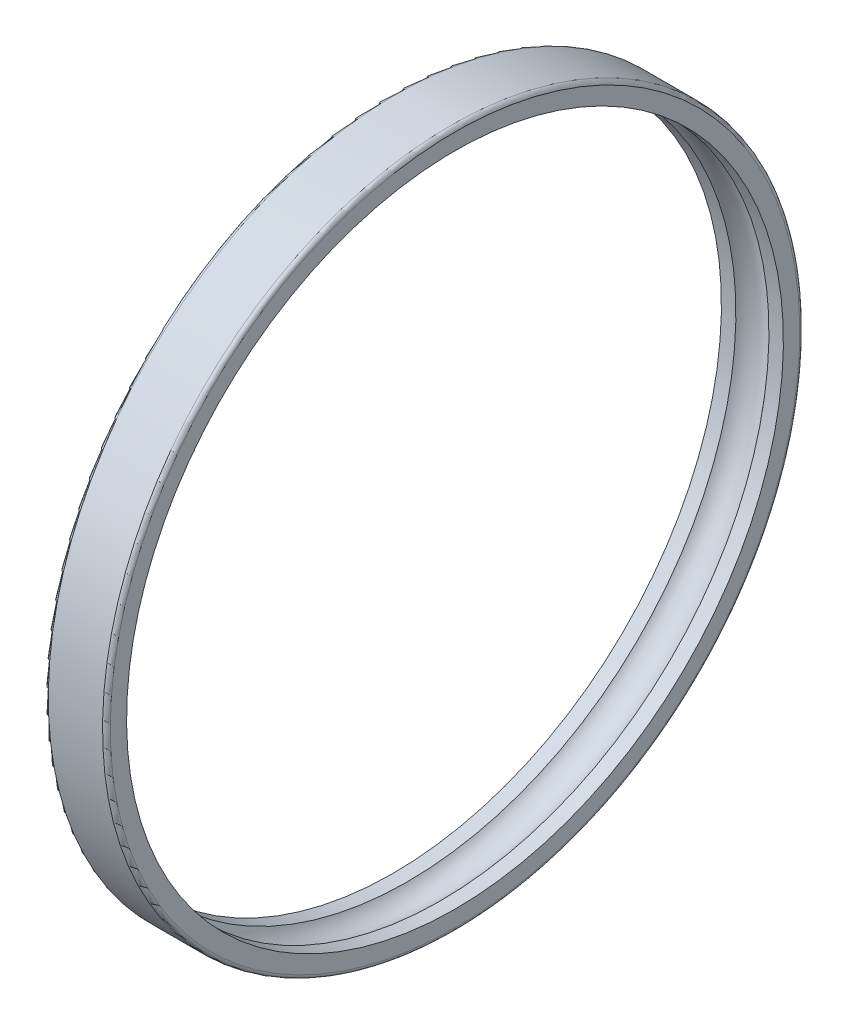
ISO-10303-21;
HEADER;
FILE_DESCRIPTION(('STEP AP214'),'2;1');
FILE_NAME('part.step','',(''),(''),'','','');
FILE_SCHEMA(('AUTOMOTIVE_DESIGN { 1 0 10303 214 1 1 1 1 }'));
ENDSEC;
DATA;
#1=APPLICATION_CONTEXT('core data for automotive mechanical design processes');
#2=APPLICATION_PROTOCOL_DEFINITION('international standard','automotive_design',2000,#1);
#3=PRODUCT_CONTEXT('',#1,'mechanical');
#4=PRODUCT('Part','Part','',(#3));
#5=PRODUCT_RELATED_PRODUCT_CATEGORY('part','',(#4));
#6=PRODUCT_DEFINITION_FORMATION('','',#4);
#7=PRODUCT_DEFINITION_CONTEXT('part definition',#1,'design');
#8=PRODUCT_DEFINITION('design','',#6,#7);
#9=PRODUCT_DEFINITION_SHAPE('','',#8);
#10=(LENGTH_UNIT() NAMED_UNIT(*) SI_UNIT(.MILLI.,.METRE.));
#11=(NAMED_UNIT(*) PLANE_ANGLE_UNIT() SI_UNIT($,.RADIAN.));
#12=(NAMED_UNIT(*) SI_UNIT($,.STERADIAN.) SOLID_ANGLE_UNIT());
#13=UNCERTAINTY_MEASURE_WITH_UNIT(LENGTH_MEASURE(1.E-05),#10,'distance_accuracy_value','');
#14=(GEOMETRIC_REPRESENTATION_CONTEXT(3) GLOBAL_UNCERTAINTY_ASSIGNED_CONTEXT((#13)) GLOBAL_UNIT_ASSIGNED_CONTEXT((#10,
#11,#12)) REPRESENTATION_CONTEXT('',''));
#15=CARTESIAN_POINT('',(0.,0.,0.));
#16=DIRECTION('',(0.,0.,1.));
#17=DIRECTION('',(1.,0.,0.));
#18=AXIS2_PLACEMENT_3D('',#15,#16,#17);
#19=CARTESIAN_POINT('',(-9.00099999999988,0.,0.));
#20=DIRECTION('',(1.,0.,0.));
#21=DIRECTION('',(0.,-0.866025403784439,-0.5));
#22=AXIS2_PLACEMENT_3D('',#19,#20,#21);
#23=TOROIDAL_SURFACE('',#22,133.5,1.49999999999995);
#24=CARTESIAN_POINT('',(-9.00099999999988,0.,0.));
#25=DIRECTION('',(1.,0.,0.));
#26=DIRECTION('',(0.,-0.866025403784439,-0.5));
#27=AXIS2_PLACEMENT_3D('',#24,#25,#26);
#28=CIRCLE('',#27,135.);
#29=CARTESIAN_POINT('',(-9.00099999999989,116.913429510899,67.5));
#30=VERTEX_POINT('',#29);
#31=EDGE_CURVE('E25',#30,#30,#28,.T.);
#32=ORIENTED_EDGE('',*,*,#31,.F.);
#33=CARTESIAN_POINT('',(-9.00099999999989,115.614391405223,66.75));
#34=DIRECTION('',(0.,-0.5,0.866025403784439));
#35=DIRECTION('',(0.,0.866025403784439,0.5));
#36=AXIS2_PLACEMENT_3D('',#33,#34,#35);
#37=CIRCLE('',#36,1.49999999999995);
#38=CARTESIAN_POINT('',(-10.501,115.614391405223,66.75));
#39=VERTEX_POINT('',#38);
#40=EDGE_CURVE('E11',#30,#39,#37,.T.);
#41=ORIENTED_EDGE('',*,*,#40,.T.);
#42=CARTESIAN_POINT('',(-10.501,0.,0.));
#43=DIRECTION('',(1.,0.,0.));
#44=DIRECTION('',(0.,-0.866025403784439,-0.5));
#45=AXIS2_PLACEMENT_3D('',#42,#43,#44);
#46=CIRCLE('',#45,133.5);
#47=EDGE_CURVE('E70',#39,#39,#46,.T.);
#48=ORIENTED_EDGE('',*,*,#47,.T.);
#49=ORIENTED_EDGE('',*,*,#40,.F.);
#50=EDGE_LOOP('',(#32,#41,#48,#49));
#51=FACE_BOUND('',#50,.T.);
#52=ADVANCED_FACE('F17',(#51),#23,.T.);
#53=CARTESIAN_POINT('',(13.499,0.,0.));
#54=DIRECTION('',(1.,0.,0.));
#55=DIRECTION('',(0.,-0.866025403784439,-0.5));
#56=AXIS2_PLACEMENT_3D('',#53,#54,#55);
#57=CYLINDRICAL_SURFACE('',#56,135.);
#58=CARTESIAN_POINT('',(11.999,0.,0.));
#59=DIRECTION('',(1.,0.,0.));
#60=DIRECTION('',(0.,-0.866025403784439,-0.5));
#61=AXIS2_PLACEMENT_3D('',#58,#59,#60);
#62=CIRCLE('',#61,135.);
#63=CARTESIAN_POINT('',(11.999,116.913429510899,67.5));
#64=VERTEX_POINT('',#63);
#65=EDGE_CURVE('E74',#64,#64,#62,.T.);
#66=ORIENTED_EDGE('',*,*,#65,.F.);
#67=DIRECTION('',(-1.,0.,0.));
#68=VECTOR('',#67,1.);
#69=CARTESIAN_POINT('',(13.499,116.913429510899,67.5));
#70=LINE('',#69,#68);
#71=EDGE_CURVE('E44',#64,#30,#70,.T.);
#72=ORIENTED_EDGE('',*,*,#71,.T.);
#73=ORIENTED_EDGE('',*,*,#31,.T.);
#74=ORIENTED_EDGE('',*,*,#71,.F.);
#75=EDGE_LOOP('',(#66,#72,#73,#74));
#76=FACE_BOUND('',#75,.T.);
#77=ADVANCED_FACE('F73',(#76),#57,.T.);
#78=CARTESIAN_POINT('',(11.999,0.,0.));
#79=DIRECTION('',(1.,0.,0.));
#80=DIRECTION('',(0.,-0.866025403784439,-0.5));
#81=AXIS2_PLACEMENT_3D('',#78,#79,#80);
#82=TOROIDAL_SURFACE('',#81,133.5,1.49999999999996);
#83=CARTESIAN_POINT('',(13.499,0.,0.));
#84=DIRECTION('',(1.,0.,0.));
#85=DIRECTION('',(0.,-0.866025403784439,-0.5));
#86=AXIS2_PLACEMENT_3D('',#83,#84,#85);
#87=CIRCLE('',#86,133.5);
#88=CARTESIAN_POINT('',(13.499,115.614391405223,66.75));
#89=VERTEX_POINT('',#88);
#90=EDGE_CURVE('E85',#89,#89,#87,.T.);
#91=ORIENTED_EDGE('',*,*,#90,.F.);
#92=CARTESIAN_POINT('',(11.999,115.614391405223,66.75));
#93=DIRECTION('',(0.,-0.5,0.866025403784439));
#94=DIRECTION('',(0.,0.866025403784439,0.5));
#95=AXIS2_PLACEMENT_3D('',#92,#93,#94);
#96=CIRCLE('',#95,1.49999999999996);
#97=EDGE_CURVE('E79',#89,#64,#96,.T.);
#98=ORIENTED_EDGE('',*,*,#97,.T.);
#99=ORIENTED_EDGE('',*,*,#65,.T.);
#100=ORIENTED_EDGE('',*,*,#97,.F.);
#101=EDGE_LOOP('',(#91,#98,#99,#100));
#102=FACE_BOUND('',#101,.T.);
#103=ADVANCED_FACE('F132',(#102),#82,.T.);
#104=CARTESIAN_POINT('',(13.499,63.59375,-110.147606043833));
#105=DIRECTION('',(1.,0.,0.));
#106=DIRECTION('',(0.,1.,0.));
#107=AXIS2_PLACEMENT_3D('',#104,#105,#106);
#108=PLANE('',#107);
#109=CARTESIAN_POINT('',(13.499,0.,0.));
#110=DIRECTION('',(1.,0.,0.));
#111=DIRECTION('',(0.,-0.866025403784439,-0.5));
#112=AXIS2_PLACEMENT_3D('',#109,#110,#111);
#113=CIRCLE('',#112,127.1875);
#114=CARTESIAN_POINT('',(13.499,110.147606043833,63.59375));
#115=VERTEX_POINT('',#114);
#116=EDGE_CURVE('E82',#115,#115,#113,.T.);
#117=ORIENTED_EDGE('',*,*,#116,.F.);
#118=EDGE_LOOP('',(#117));
#119=FACE_BOUND('',#118,.T.);
#120=ORIENTED_EDGE('',*,*,#90,.T.);
#121=EDGE_LOOP('',(#120));
#122=FACE_BOUND('',#121,.T.);
#123=ADVANCED_FACE('F134',(#119,#122),#108,.T.);
#124=CARTESIAN_POINT('',(13.499,0.,0.));
#125=DIRECTION('',(1.,0.,0.));
#126=DIRECTION('',(0.,-0.866025403784439,-0.5));
#127=AXIS2_PLACEMENT_3D('',#124,#125,#126);
#128=CYLINDRICAL_SURFACE('',#127,127.1875);
#129=CARTESIAN_POINT('',(7.9033442287249,0.,0.));
#130=DIRECTION('',(1.,0.,0.));
#131=DIRECTION('',(0.,-0.866025403784439,-0.5));
#132=AXIS2_PLACEMENT_3D('',#129,#130,#131);
#133=CIRCLE('',#132,127.1875);
#134=CARTESIAN_POINT('',(7.9033442287249,110.147606043833,63.59375));
#135=VERTEX_POINT('',#134);
#136=EDGE_CURVE('E90',#135,#135,#133,.T.);
#137=ORIENTED_EDGE('',*,*,#136,.F.);
#138=DIRECTION('',(1.,0.,0.));
#139=VECTOR('',#138,1.);
#140=CARTESIAN_POINT('',(13.499,110.147606043833,63.59375));
#141=LINE('',#140,#139);
#142=EDGE_CURVE('E86',#135,#115,#141,.T.);
#143=ORIENTED_EDGE('',*,*,#142,.T.);
#144=ORIENTED_EDGE('',*,*,#116,.T.);
#145=ORIENTED_EDGE('',*,*,#142,.F.);
#146=EDGE_LOOP('',(#137,#143,#144,#145));
#147=FACE_BOUND('',#146,.T.);
#148=ADVANCED_FACE('F136',(#147),#128,.F.);
#149=CARTESIAN_POINT('',(1.49900000000017,0.,0.));
#150=DIRECTION('',(1.,0.,0.));
#151=DIRECTION('',(0.,-0.866025403784439,-0.5));
#152=AXIS2_PLACEMENT_3D('',#149,#150,#151);
#153=TOROIDAL_SURFACE('',#152,122.1875,8.125);
#154=CARTESIAN_POINT('',(-4.90534422872464,0.,0.));
#155=DIRECTION('',(1.,0.,0.));
#156=DIRECTION('',(0.,-0.866025403784439,-0.5));
#157=AXIS2_PLACEMENT_3D('',#154,#155,#156);
#158=CIRCLE('',#157,127.1875);
#159=CARTESIAN_POINT('',(-4.90534422872465,110.147606043833,63.59375));
#160=VERTEX_POINT('',#159);
#161=EDGE_CURVE('E101',#160,#160,#158,.T.);
#162=ORIENTED_EDGE('',*,*,#161,.F.);
#163=CARTESIAN_POINT('',(1.49900000000016,105.817479024911,61.09375));
#164=DIRECTION('',(0.,0.5,-0.866025403784439));
#165=DIRECTION('',(0.,0.866025403784439,0.5));
#166=AXIS2_PLACEMENT_3D('',#163,#164,#165);
#167=CIRCLE('',#166,8.125);
#168=EDGE_CURVE('E96',#160,#135,#167,.T.);
#169=ORIENTED_EDGE('',*,*,#168,.T.);
#170=ORIENTED_EDGE('',*,*,#136,.T.);
#171=ORIENTED_EDGE('',*,*,#168,.F.);
#172=EDGE_LOOP('',(#162,#169,#170,#171));
#173=FACE_BOUND('',#172,.T.);
#174=ADVANCED_FACE('F144',(#173),#153,.F.);
#175=CARTESIAN_POINT('',(13.499,0.,0.));
#176=DIRECTION('',(1.,0.,0.));
#177=DIRECTION('',(0.,-0.866025403784439,-0.5));
#178=AXIS2_PLACEMENT_3D('',#175,#176,#177);
#179=CYLINDRICAL_SURFACE('',#178,127.1875);
#180=CARTESIAN_POINT('',(-10.501,0.,0.));
#181=DIRECTION('',(1.,0.,0.));
#182=DIRECTION('',(0.,-0.866025403784439,-0.5));
#183=AXIS2_PLACEMENT_3D('',#180,#181,#182);
#184=CIRCLE('',#183,127.1875);
#185=CARTESIAN_POINT('',(-10.501,110.147606043833,63.59375));
#186=VERTEX_POINT('',#185);
#187=EDGE_CURVE('E106',#186,#186,#184,.T.);
#188=ORIENTED_EDGE('',*,*,#187,.F.);
#189=DIRECTION('',(1.,0.,0.));
#190=VECTOR('',#189,1.);
#191=CARTESIAN_POINT('',(13.499,110.147606043833,63.59375));
#192=LINE('',#191,#190);
#193=EDGE_CURVE('E102',#186,#160,#192,.T.);
#194=ORIENTED_EDGE('',*,*,#193,.T.);
#195=ORIENTED_EDGE('',*,*,#161,.T.);
#196=ORIENTED_EDGE('',*,*,#193,.F.);
#197=EDGE_LOOP('',(#188,#194,#195,#196));
#198=FACE_BOUND('',#197,.T.);
#199=ADVANCED_FACE('F187',(#198),#179,.F.);
#200=CARTESIAN_POINT('',(-10.501,66.75,-115.614391405223));
#201=DIRECTION('',(-1.,0.,0.));
#202=DIRECTION('',(0.,1.,0.));
#203=AXIS2_PLACEMENT_3D('',#200,#201,#202);
#204=PLANE('',#203);
#205=ORIENTED_EDGE('',*,*,#187,.T.);
#206=EDGE_LOOP('',(#205));
#207=FACE_BOUND('',#206,.T.);
#208=ORIENTED_EDGE('',*,*,#47,.F.);
#209=EDGE_LOOP('',(#208));
#210=FACE_BOUND('',#209,.T.);
#211=ADVANCED_FACE('F196',(#207,#210),#204,.T.);
#212=CLOSED_SHELL('',(#52,#77,#103,#123,#148,#174,#199,#211));
#213=MANIFOLD_SOLID_BREP('B1',#212);
#214=ADVANCED_BREP_SHAPE_REPRESENTATION('',(#18,#213),#14);
#215=SHAPE_DEFINITION_REPRESENTATION(#9,#214);
ENDSEC;
END-ISO-10303-21;
